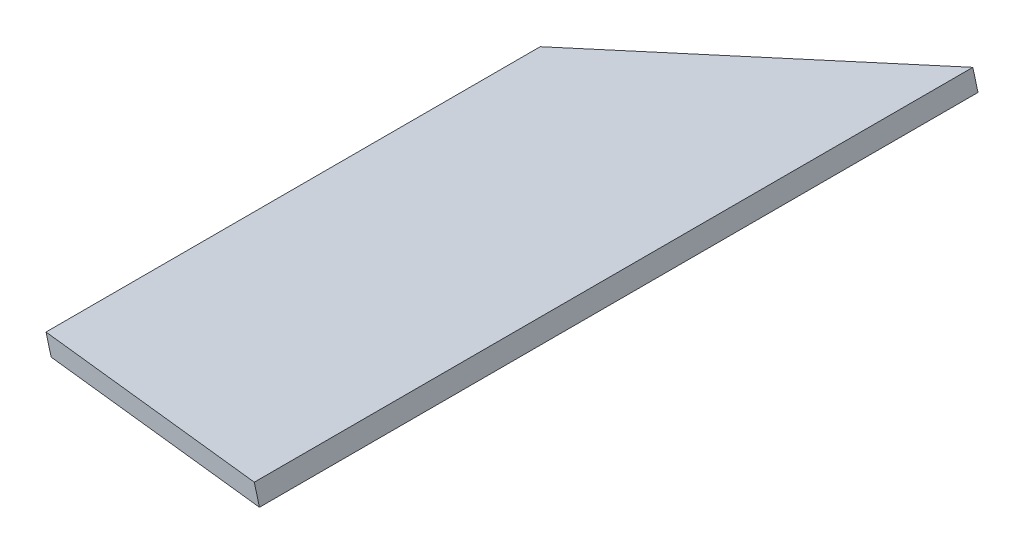
ISO-10303-21;
HEADER;
FILE_DESCRIPTION(('STEP AP214'),'2;1');
FILE_NAME('part.step','',(''),(''),'','','');
FILE_SCHEMA(('AUTOMOTIVE_DESIGN { 1 0 10303 214 1 1 1 1 }'));
ENDSEC;
DATA;
#1=APPLICATION_CONTEXT('core data for automotive mechanical design processes');
#2=APPLICATION_PROTOCOL_DEFINITION('international standard','automotive_design',2000,#1);
#3=PRODUCT_CONTEXT('',#1,'mechanical');
#4=PRODUCT('Part','Part','',(#3));
#5=PRODUCT_RELATED_PRODUCT_CATEGORY('part','',(#4));
#6=PRODUCT_DEFINITION_FORMATION('','',#4);
#7=PRODUCT_DEFINITION_CONTEXT('part definition',#1,'design');
#8=PRODUCT_DEFINITION('design','',#6,#7);
#9=PRODUCT_DEFINITION_SHAPE('','',#8);
#10=(LENGTH_UNIT() NAMED_UNIT(*) SI_UNIT(.MILLI.,.METRE.));
#11=(NAMED_UNIT(*) PLANE_ANGLE_UNIT() SI_UNIT($,.RADIAN.));
#12=(NAMED_UNIT(*) SI_UNIT($,.STERADIAN.) SOLID_ANGLE_UNIT());
#13=UNCERTAINTY_MEASURE_WITH_UNIT(LENGTH_MEASURE(1.E-05),#10,'distance_accuracy_value','');
#14=(GEOMETRIC_REPRESENTATION_CONTEXT(3) GLOBAL_UNCERTAINTY_ASSIGNED_CONTEXT((#13)) GLOBAL_UNIT_ASSIGNED_CONTEXT((#10,
#11,#12)) REPRESENTATION_CONTEXT('',''));
#15=CARTESIAN_POINT('',(0.,0.,0.));
#16=DIRECTION('',(0.,0.,1.));
#17=DIRECTION('',(1.,0.,0.));
#18=AXIS2_PLACEMENT_3D('',#15,#16,#17);
#19=CARTESIAN_POINT('',(-117.157963321617,122.548432248302,-240.469013255375));
#20=DIRECTION('',(-0.309165571015442,-0.0832368845041575,-0.947358575596768));
#21=DIRECTION('',(-0.95065755757945,0.,0.31024217672179));
#22=AXIS2_PLACEMENT_3D('',#19,#20,#21);
#23=PLANE('',#22);
#24=DIRECTION('',(-0.914784369565934,-0.246288099498521,0.320174529348077));
#25=VECTOR('',#24,1.);
#26=CARTESIAN_POINT('',(-118.48853355607,127.490550261987,-240.469013255375));
#27=LINE('',#26,#25);
#28=CARTESIAN_POINT('',(-533.4,15.7836169886209,-95.2499999999999));
#29=VERTEX_POINT('',#28);
#30=CARTESIAN_POINT('',(-615.95,-6.44138301137917,-66.3574999999998));
#31=VERTEX_POINT('',#30);
#32=EDGE_CURVE('E99',#29,#31,#27,.T.);
#33=ORIENTED_EDGE('',*,*,#32,.F.);
#34=DIRECTION('',(-0.259973473447873,0.96561575852067,0.));
#35=VECTOR('',#34,1.);
#36=CARTESIAN_POINT('',(-532.069429765546,10.8414989749362,-95.2499999999999));
#37=LINE('',#36,#35);
#38=CARTESIAN_POINT('',(-532.069429765546,10.8414989749362,-95.2499999999999));
#39=VERTEX_POINT('',#38);
#40=EDGE_CURVE('E11',#39,#29,#37,.T.);
#41=ORIENTED_EDGE('',*,*,#40,.F.);
#42=DIRECTION('',(-0.914784369565934,-0.246288099498521,0.320174529348077));
#43=VECTOR('',#42,1.);
#44=CARTESIAN_POINT('',(-117.157963321617,122.548432248302,-240.469013255375));
#45=LINE('',#44,#43);
#46=CARTESIAN_POINT('',(-614.619429765547,-11.3835010250638,-66.3574999999998));
#47=VERTEX_POINT('',#46);
#48=EDGE_CURVE('E93',#39,#47,#45,.T.);
#49=ORIENTED_EDGE('',*,*,#48,.T.);
#50=DIRECTION('',(-0.259973473447873,0.96561575852067,0.));
#51=VECTOR('',#50,1.);
#52=CARTESIAN_POINT('',(-614.619429765547,-11.3835010250638,-66.3574999999998));
#53=LINE('',#52,#51);
#54=EDGE_CURVE('E38',#47,#31,#53,.T.);
#55=ORIENTED_EDGE('',*,*,#54,.T.);
#56=EDGE_LOOP('',(#33,#41,#49,#55));
#57=FACE_BOUND('',#56,.T.);
#58=ADVANCED_FACE('F35',(#57),#23,.T.);
#59=CARTESIAN_POINT('',(-532.069429765546,10.8414989749362,0.));
#60=DIRECTION('',(0.96561575852067,0.259973473447873,0.));
#61=DIRECTION('',(-0.259973473447873,0.96561575852067,0.));
#62=AXIS2_PLACEMENT_3D('',#59,#60,#61);
#63=PLANE('',#62);
#64=DIRECTION('',(0.,0.,-1.));
#65=VECTOR('',#64,1.);
#66=CARTESIAN_POINT('',(-533.4,15.7836169886209,0.));
#67=LINE('',#66,#65);
#68=CARTESIAN_POINT('',(-533.4,15.7836169886209,89.8475049660833));
#69=VERTEX_POINT('',#68);
#70=EDGE_CURVE('E95',#69,#29,#67,.T.);
#71=ORIENTED_EDGE('',*,*,#70,.F.);
#72=DIRECTION('',(-0.259973473447873,0.96561575852067,0.));
#73=VECTOR('',#72,1.);
#74=CARTESIAN_POINT('',(-532.069429765546,10.8414989749363,89.8475049660833));
#75=LINE('',#74,#73);
#76=CARTESIAN_POINT('',(-532.069429765546,10.8414989749363,89.8475049660833));
#77=VERTEX_POINT('',#76);
#78=EDGE_CURVE('E44',#77,#69,#75,.T.);
#79=ORIENTED_EDGE('',*,*,#78,.F.);
#80=DIRECTION('',(0.,0.,-1.));
#81=VECTOR('',#80,1.);
#82=CARTESIAN_POINT('',(-532.069429765546,10.8414989749362,0.));
#83=LINE('',#82,#81);
#84=EDGE_CURVE('E90',#77,#39,#83,.T.);
#85=ORIENTED_EDGE('',*,*,#84,.T.);
#86=ORIENTED_EDGE('',*,*,#40,.T.);
#87=EDGE_LOOP('',(#71,#79,#85,#86));
#88=FACE_BOUND('',#87,.T.);
#89=ADVANCED_FACE('F109',(#88),#63,.T.);
#90=CARTESIAN_POINT('',(-115.575623012603,122.974446946883,235.620337329614));
#91=DIRECTION('',(-0.309165571015442,-0.0832368845041575,0.947358575596768));
#92=DIRECTION('',(0.95065755757945,0.,0.31024217672179));
#93=AXIS2_PLACEMENT_3D('',#90,#91,#92);
#94=PLANE('',#93);
#95=DIRECTION('',(0.914784369565934,0.246288099498521,0.320174529348077));
#96=VECTOR('',#95,1.);
#97=CARTESIAN_POINT('',(-116.906193247056,127.916564960567,235.620337329614));
#98=LINE('',#97,#96);
#99=CARTESIAN_POINT('',(-615.95,-6.44138301137917,60.9550049660832));
#100=VERTEX_POINT('',#99);
#101=EDGE_CURVE('E85',#100,#69,#98,.T.);
#102=ORIENTED_EDGE('',*,*,#101,.F.);
#103=DIRECTION('',(-0.259973473447873,0.96561575852067,0.));
#104=VECTOR('',#103,1.);
#105=CARTESIAN_POINT('',(-614.619429765547,-11.3835010250638,60.9550049660832));
#106=LINE('',#105,#104);
#107=CARTESIAN_POINT('',(-614.619429765547,-11.3835010250638,60.9550049660832));
#108=VERTEX_POINT('',#107);
#109=EDGE_CURVE('E80',#108,#100,#106,.T.);
#110=ORIENTED_EDGE('',*,*,#109,.F.);
#111=DIRECTION('',(0.914784369565934,0.246288099498521,0.320174529348077));
#112=VECTOR('',#111,1.);
#113=CARTESIAN_POINT('',(-115.575623012603,122.974446946883,235.620337329614));
#114=LINE('',#113,#112);
#115=EDGE_CURVE('E83',#108,#77,#114,.T.);
#116=ORIENTED_EDGE('',*,*,#115,.T.);
#117=ORIENTED_EDGE('',*,*,#78,.T.);
#118=EDGE_LOOP('',(#102,#110,#116,#117));
#119=FACE_BOUND('',#118,.T.);
#120=ADVANCED_FACE('F82',(#119),#94,.T.);
#121=CARTESIAN_POINT('',(-614.619429765547,-11.3835010250638,0.));
#122=DIRECTION('',(-0.96561575852067,-0.259973473447873,0.));
#123=DIRECTION('',(0.259973473447873,-0.96561575852067,0.));
#124=AXIS2_PLACEMENT_3D('',#121,#122,#123);
#125=PLANE('',#124);
#126=DIRECTION('',(0.,0.,1.));
#127=VECTOR('',#126,1.);
#128=CARTESIAN_POINT('',(-615.95,-6.44138301137917,0.));
#129=LINE('',#128,#127);
#130=EDGE_CURVE('E102',#31,#100,#129,.T.);
#131=ORIENTED_EDGE('',*,*,#130,.F.);
#132=ORIENTED_EDGE('',*,*,#54,.F.);
#133=DIRECTION('',(0.,0.,1.));
#134=VECTOR('',#133,1.);
#135=CARTESIAN_POINT('',(-614.619429765547,-11.3835010250638,0.));
#136=LINE('',#135,#134);
#137=EDGE_CURVE('E89',#47,#108,#136,.T.);
#138=ORIENTED_EDGE('',*,*,#137,.T.);
#139=ORIENTED_EDGE('',*,*,#109,.T.);
#140=EDGE_LOOP('',(#131,#132,#138,#139));
#141=FACE_BOUND('',#140,.T.);
#142=ADVANCED_FACE('F92',(#141),#125,.T.);
#143=CARTESIAN_POINT('',(-38.6821446509658,143.676537275016,0.));
#144=DIRECTION('',(-0.259973473447873,0.96561575852067,0.));
#145=DIRECTION('',(-0.96561575852067,-0.259973473447873,0.));
#146=AXIS2_PLACEMENT_3D('',#143,#144,#145);
#147=PLANE('',#146);
#148=ORIENTED_EDGE('',*,*,#48,.F.);
#149=ORIENTED_EDGE('',*,*,#84,.F.);
#150=ORIENTED_EDGE('',*,*,#115,.F.);
#151=ORIENTED_EDGE('',*,*,#137,.F.);
#152=EDGE_LOOP('',(#148,#149,#150,#151));
#153=FACE_BOUND('',#152,.T.);
#154=ADVANCED_FACE('F88',(#153),#147,.F.);
#155=CARTESIAN_POINT('',(-40.0127148854193,148.6186552887,0.));
#156=DIRECTION('',(-0.259973473447873,0.96561575852067,0.));
#157=DIRECTION('',(-0.96561575852067,-0.259973473447873,0.));
#158=AXIS2_PLACEMENT_3D('',#155,#156,#157);
#159=PLANE('',#158);
#160=ORIENTED_EDGE('',*,*,#32,.T.);
#161=ORIENTED_EDGE('',*,*,#130,.T.);
#162=ORIENTED_EDGE('',*,*,#101,.T.);
#163=ORIENTED_EDGE('',*,*,#70,.T.);
#164=EDGE_LOOP('',(#160,#161,#162,#163));
#165=FACE_BOUND('',#164,.T.);
#166=ADVANCED_FACE('F108',(#165),#159,.T.);
#167=CLOSED_SHELL('',(#58,#89,#120,#142,#154,#166));
#168=MANIFOLD_SOLID_BREP('B2',#167);
#169=ADVANCED_BREP_SHAPE_REPRESENTATION('',(#18,#168),#14);
#170=SHAPE_DEFINITION_REPRESENTATION(#9,#169);
ENDSEC;
END-ISO-10303-21;
